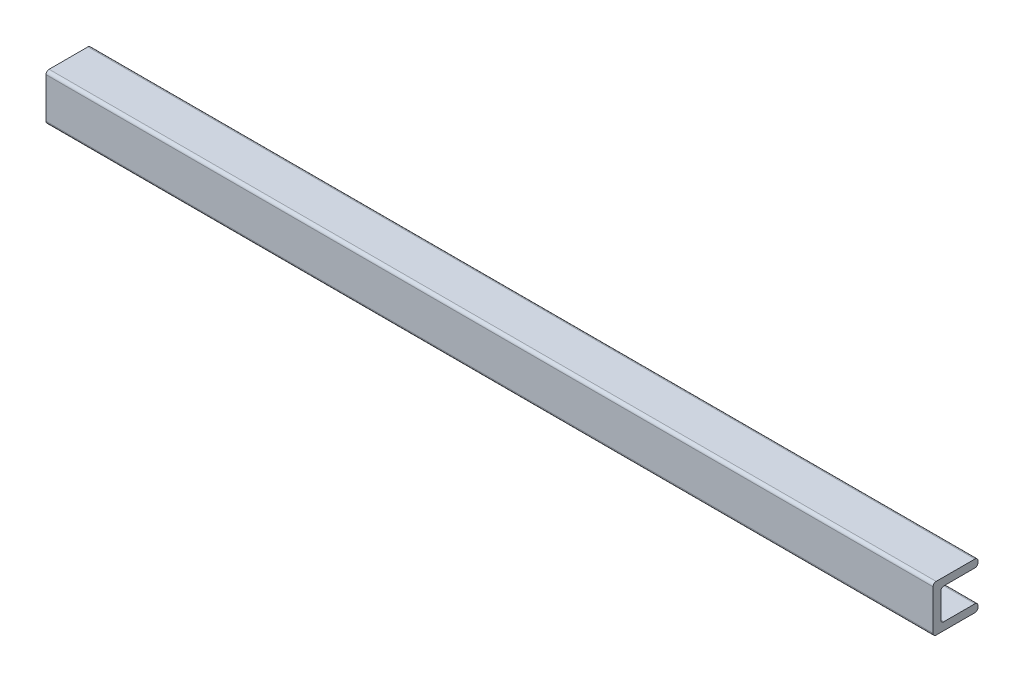
ISO-10303-21;
HEADER;
FILE_DESCRIPTION(('STEP AP214'),'2;1');
FILE_NAME('part.step','',(''),(''),'','','');
FILE_SCHEMA(('AUTOMOTIVE_DESIGN { 1 0 10303 214 1 1 1 1 }'));
ENDSEC;
DATA;
#1=APPLICATION_CONTEXT('core data for automotive mechanical design processes');
#2=APPLICATION_PROTOCOL_DEFINITION('international standard','automotive_design',2000,#1);
#3=PRODUCT_CONTEXT('',#1,'mechanical');
#4=PRODUCT('Part','Part','',(#3));
#5=PRODUCT_RELATED_PRODUCT_CATEGORY('part','',(#4));
#6=PRODUCT_DEFINITION_FORMATION('','',#4);
#7=PRODUCT_DEFINITION_CONTEXT('part definition',#1,'design');
#8=PRODUCT_DEFINITION('design','',#6,#7);
#9=PRODUCT_DEFINITION_SHAPE('','',#8);
#10=(LENGTH_UNIT() NAMED_UNIT(*) SI_UNIT(.MILLI.,.METRE.));
#11=(NAMED_UNIT(*) PLANE_ANGLE_UNIT() SI_UNIT($,.RADIAN.));
#12=(NAMED_UNIT(*) SI_UNIT($,.STERADIAN.) SOLID_ANGLE_UNIT());
#13=UNCERTAINTY_MEASURE_WITH_UNIT(LENGTH_MEASURE(1.E-05),#10,'distance_accuracy_value','');
#14=(GEOMETRIC_REPRESENTATION_CONTEXT(3) GLOBAL_UNCERTAINTY_ASSIGNED_CONTEXT((#13)) GLOBAL_UNIT_ASSIGNED_CONTEXT((#10,
#11,#12)) REPRESENTATION_CONTEXT('',''));
#15=CARTESIAN_POINT('',(0.,0.,0.));
#16=DIRECTION('',(0.,0.,1.));
#17=DIRECTION('',(1.,0.,0.));
#18=AXIS2_PLACEMENT_3D('',#15,#16,#17);
#19=CARTESIAN_POINT('',(602.,12.,168.));
#20=DIRECTION('',(-1.,0.,0.));
#21=DIRECTION('',(0.,0.,1.));
#22=AXIS2_PLACEMENT_3D('',#19,#20,#21);
#23=CYLINDRICAL_SURFACE('',#22,2.);
#24=CARTESIAN_POINT('',(30.,12.,168.));
#25=DIRECTION('',(1.,0.,0.));
#26=DIRECTION('',(0.,0.,-1.));
#27=AXIS2_PLACEMENT_3D('',#24,#25,#26);
#28=CIRCLE('',#27,2.);
#29=CARTESIAN_POINT('',(30.,10.,168.));
#30=VERTEX_POINT('',#29);
#31=CARTESIAN_POINT('',(30.,12.,166.));
#32=VERTEX_POINT('',#31);
#33=EDGE_CURVE('E219',#30,#32,#28,.T.);
#34=ORIENTED_EDGE('',*,*,#33,.T.);
#35=DIRECTION('',(-1.,0.,0.));
#36=VECTOR('',#35,1.);
#37=CARTESIAN_POINT('',(602.,12.,166.));
#38=LINE('',#37,#36);
#39=CARTESIAN_POINT('',(602.,12.,166.));
#40=VERTEX_POINT('',#39);
#41=EDGE_CURVE('E13',#40,#32,#38,.T.);
#42=ORIENTED_EDGE('',*,*,#41,.F.);
#43=CARTESIAN_POINT('',(602.,12.,168.));
#44=DIRECTION('',(1.,0.,0.));
#45=DIRECTION('',(0.,0.,-1.));
#46=AXIS2_PLACEMENT_3D('',#43,#44,#45);
#47=CIRCLE('',#46,2.);
#48=CARTESIAN_POINT('',(602.,10.,168.));
#49=VERTEX_POINT('',#48);
#50=EDGE_CURVE('E267',#49,#40,#47,.T.);
#51=ORIENTED_EDGE('',*,*,#50,.F.);
#52=DIRECTION('',(-1.,0.,0.));
#53=VECTOR('',#52,1.);
#54=CARTESIAN_POINT('',(602.,10.,168.));
#55=LINE('',#54,#53);
#56=EDGE_CURVE('E215',#49,#30,#55,.T.);
#57=ORIENTED_EDGE('',*,*,#56,.T.);
#58=EDGE_LOOP('',(#34,#42,#51,#57));
#59=FACE_BOUND('',#58,.T.);
#60=ADVANCED_FACE('F57',(#59),#23,.T.);
#61=CARTESIAN_POINT('',(602.,13.,166.));
#62=DIRECTION('',(0.,0.,1.));
#63=DIRECTION('',(0.,-1.,0.));
#64=AXIS2_PLACEMENT_3D('',#61,#62,#63);
#65=PLANE('',#64);
#66=DIRECTION('',(0.,1.,0.));
#67=VECTOR('',#66,1.);
#68=CARTESIAN_POINT('',(30.,13.,166.));
#69=LINE('',#68,#67);
#70=CARTESIAN_POINT('',(30.,13.,166.));
#71=VERTEX_POINT('',#70);
#72=EDGE_CURVE('E223',#32,#71,#69,.T.);
#73=ORIENTED_EDGE('',*,*,#72,.T.);
#74=DIRECTION('',(-1.,0.,0.));
#75=VECTOR('',#74,1.);
#76=CARTESIAN_POINT('',(602.,13.,166.));
#77=LINE('',#76,#75);
#78=CARTESIAN_POINT('',(602.,13.,166.));
#79=VERTEX_POINT('',#78);
#80=EDGE_CURVE('E65',#79,#71,#77,.T.);
#81=ORIENTED_EDGE('',*,*,#80,.F.);
#82=DIRECTION('',(0.,1.,0.));
#83=VECTOR('',#82,1.);
#84=CARTESIAN_POINT('',(602.,13.,166.));
#85=LINE('',#84,#83);
#86=EDGE_CURVE('E146',#40,#79,#85,.T.);
#87=ORIENTED_EDGE('',*,*,#86,.F.);
#88=ORIENTED_EDGE('',*,*,#41,.T.);
#89=EDGE_LOOP('',(#73,#81,#87,#88));
#90=FACE_BOUND('',#89,.T.);
#91=ADVANCED_FACE('F483',(#90),#65,.F.);
#92=CARTESIAN_POINT('',(602.,13.,168.));
#93=DIRECTION('',(-1.,0.,0.));
#94=DIRECTION('',(0.,0.,1.));
#95=AXIS2_PLACEMENT_3D('',#92,#93,#94);
#96=CYLINDRICAL_SURFACE('',#95,2.00000000000001);
#97=CARTESIAN_POINT('',(30.,13.,168.));
#98=DIRECTION('',(1.,0.,0.));
#99=DIRECTION('',(0.,0.,1.));
#100=AXIS2_PLACEMENT_3D('',#97,#98,#99);
#101=CIRCLE('',#100,2.00000000000001);
#102=CARTESIAN_POINT('',(30.,15.,168.));
#103=VERTEX_POINT('',#102);
#104=EDGE_CURVE('E227',#71,#103,#101,.T.);
#105=ORIENTED_EDGE('',*,*,#104,.T.);
#106=DIRECTION('',(-1.,0.,0.));
#107=VECTOR('',#106,1.);
#108=CARTESIAN_POINT('',(602.,15.,168.));
#109=LINE('',#108,#107);
#110=CARTESIAN_POINT('',(602.,15.,168.));
#111=VERTEX_POINT('',#110);
#112=EDGE_CURVE('E310',#111,#103,#109,.T.);
#113=ORIENTED_EDGE('',*,*,#112,.F.);
#114=CARTESIAN_POINT('',(602.,13.,168.));
#115=DIRECTION('',(1.,0.,0.));
#116=DIRECTION('',(0.,0.,1.));
#117=AXIS2_PLACEMENT_3D('',#114,#115,#116);
#118=CIRCLE('',#117,2.00000000000001);
#119=EDGE_CURVE('E321',#79,#111,#118,.T.);
#120=ORIENTED_EDGE('',*,*,#119,.F.);
#121=ORIENTED_EDGE('',*,*,#80,.T.);
#122=EDGE_LOOP('',(#105,#113,#120,#121));
#123=FACE_BOUND('',#122,.T.);
#124=ADVANCED_FACE('F319',(#123),#96,.T.);
#125=CARTESIAN_POINT('',(602.,15.,168.));
#126=DIRECTION('',(0.,-1.,0.));
#127=DIRECTION('',(0.,0.,-1.));
#128=AXIS2_PLACEMENT_3D('',#125,#126,#127);
#129=PLANE('',#128);
#130=DIRECTION('',(0.,0.,1.));
#131=VECTOR('',#130,1.);
#132=CARTESIAN_POINT('',(30.,15.,168.));
#133=LINE('',#132,#131);
#134=CARTESIAN_POINT('',(30.,15.,193.));
#135=VERTEX_POINT('',#134);
#136=EDGE_CURVE('E230',#103,#135,#133,.T.);
#137=ORIENTED_EDGE('',*,*,#136,.T.);
#138=DIRECTION('',(-1.,0.,0.));
#139=VECTOR('',#138,1.);
#140=CARTESIAN_POINT('',(602.,15.,193.));
#141=LINE('',#140,#139);
#142=CARTESIAN_POINT('',(602.,15.,193.));
#143=VERTEX_POINT('',#142);
#144=EDGE_CURVE('E306',#143,#135,#141,.T.);
#145=ORIENTED_EDGE('',*,*,#144,.F.);
#146=DIRECTION('',(0.,0.,1.));
#147=VECTOR('',#146,1.);
#148=CARTESIAN_POINT('',(602.,15.,168.));
#149=LINE('',#148,#147);
#150=EDGE_CURVE('E340',#111,#143,#149,.T.);
#151=ORIENTED_EDGE('',*,*,#150,.F.);
#152=ORIENTED_EDGE('',*,*,#112,.T.);
#153=EDGE_LOOP('',(#137,#145,#151,#152));
#154=FACE_BOUND('',#153,.T.);
#155=ADVANCED_FACE('F330',(#154),#129,.F.);
#156=CARTESIAN_POINT('',(602.,13.,193.));
#157=DIRECTION('',(-1.,0.,0.));
#158=DIRECTION('',(0.,0.,1.));
#159=AXIS2_PLACEMENT_3D('',#156,#157,#158);
#160=CYLINDRICAL_SURFACE('',#159,2.);
#161=CARTESIAN_POINT('',(30.,13.,193.));
#162=DIRECTION('',(1.,0.,0.));
#163=DIRECTION('',(0.,0.,-1.));
#164=AXIS2_PLACEMENT_3D('',#161,#162,#163);
#165=CIRCLE('',#164,2.);
#166=CARTESIAN_POINT('',(30.,13.,195.));
#167=VERTEX_POINT('',#166);
#168=EDGE_CURVE('E233',#135,#167,#165,.T.);
#169=ORIENTED_EDGE('',*,*,#168,.T.);
#170=DIRECTION('',(-1.,0.,0.));
#171=VECTOR('',#170,1.);
#172=CARTESIAN_POINT('',(602.,13.,195.));
#173=LINE('',#172,#171);
#174=CARTESIAN_POINT('',(602.,13.,195.));
#175=VERTEX_POINT('',#174);
#176=EDGE_CURVE('E302',#175,#167,#173,.T.);
#177=ORIENTED_EDGE('',*,*,#176,.F.);
#178=CARTESIAN_POINT('',(602.,13.,193.));
#179=DIRECTION('',(1.,0.,0.));
#180=DIRECTION('',(0.,0.,-1.));
#181=AXIS2_PLACEMENT_3D('',#178,#179,#180);
#182=CIRCLE('',#181,2.);
#183=EDGE_CURVE('E336',#143,#175,#182,.T.);
#184=ORIENTED_EDGE('',*,*,#183,.F.);
#185=ORIENTED_EDGE('',*,*,#144,.T.);
#186=EDGE_LOOP('',(#169,#177,#184,#185));
#187=FACE_BOUND('',#186,.T.);
#188=ADVANCED_FACE('F334',(#187),#160,.T.);
#189=CARTESIAN_POINT('',(602.,13.,195.));
#190=DIRECTION('',(0.,0.,-1.));
#191=DIRECTION('',(-1.,0.,0.));
#192=AXIS2_PLACEMENT_3D('',#189,#190,#191);
#193=PLANE('',#192);
#194=DIRECTION('',(0.,-1.,0.));
#195=VECTOR('',#194,1.);
#196=CARTESIAN_POINT('',(30.,13.,195.));
#197=LINE('',#196,#195);
#198=CARTESIAN_POINT('',(30.,-13.,195.));
#199=VERTEX_POINT('',#198);
#200=EDGE_CURVE('E236',#167,#199,#197,.T.);
#201=ORIENTED_EDGE('',*,*,#200,.T.);
#202=DIRECTION('',(-1.,0.,0.));
#203=VECTOR('',#202,1.);
#204=CARTESIAN_POINT('',(602.,-13.,195.));
#205=LINE('',#204,#203);
#206=CARTESIAN_POINT('',(602.,-13.,195.));
#207=VERTEX_POINT('',#206);
#208=EDGE_CURVE('E298',#207,#199,#205,.T.);
#209=ORIENTED_EDGE('',*,*,#208,.F.);
#210=DIRECTION('',(0.,-1.,0.));
#211=VECTOR('',#210,1.);
#212=CARTESIAN_POINT('',(602.,13.,195.));
#213=LINE('',#212,#211);
#214=EDGE_CURVE('E339',#175,#207,#213,.T.);
#215=ORIENTED_EDGE('',*,*,#214,.F.);
#216=ORIENTED_EDGE('',*,*,#176,.T.);
#217=EDGE_LOOP('',(#201,#209,#215,#216));
#218=FACE_BOUND('',#217,.T.);
#219=ADVANCED_FACE('F496',(#218),#193,.F.);
#220=CARTESIAN_POINT('',(602.,-13.,193.));
#221=DIRECTION('',(-1.,0.,0.));
#222=DIRECTION('',(0.,0.,1.));
#223=AXIS2_PLACEMENT_3D('',#220,#221,#222);
#224=CYLINDRICAL_SURFACE('',#223,2.);
#225=CARTESIAN_POINT('',(30.,-13.,193.));
#226=DIRECTION('',(1.,0.,0.));
#227=DIRECTION('',(0.,0.,-1.));
#228=AXIS2_PLACEMENT_3D('',#225,#226,#227);
#229=CIRCLE('',#228,2.);
#230=CARTESIAN_POINT('',(30.,-15.,193.));
#231=VERTEX_POINT('',#230);
#232=EDGE_CURVE('E239',#199,#231,#229,.T.);
#233=ORIENTED_EDGE('',*,*,#232,.T.);
#234=DIRECTION('',(-1.,0.,0.));
#235=VECTOR('',#234,1.);
#236=CARTESIAN_POINT('',(602.,-15.,193.));
#237=LINE('',#236,#235);
#238=CARTESIAN_POINT('',(602.,-15.,193.));
#239=VERTEX_POINT('',#238);
#240=EDGE_CURVE('E294',#239,#231,#237,.T.);
#241=ORIENTED_EDGE('',*,*,#240,.F.);
#242=CARTESIAN_POINT('',(602.,-13.,193.));
#243=DIRECTION('',(1.,0.,0.));
#244=DIRECTION('',(0.,0.,-1.));
#245=AXIS2_PLACEMENT_3D('',#242,#243,#244);
#246=CIRCLE('',#245,2.);
#247=EDGE_CURVE('E345',#207,#239,#246,.T.);
#248=ORIENTED_EDGE('',*,*,#247,.F.);
#249=ORIENTED_EDGE('',*,*,#208,.T.);
#250=EDGE_LOOP('',(#233,#241,#248,#249));
#251=FACE_BOUND('',#250,.T.);
#252=ADVANCED_FACE('F499',(#251),#224,.T.);
#253=CARTESIAN_POINT('',(602.,-15.,193.));
#254=DIRECTION('',(0.,1.,0.));
#255=DIRECTION('',(0.,0.,1.));
#256=AXIS2_PLACEMENT_3D('',#253,#254,#255);
#257=PLANE('',#256);
#258=DIRECTION('',(0.,0.,-1.));
#259=VECTOR('',#258,1.);
#260=CARTESIAN_POINT('',(30.,-15.,193.));
#261=LINE('',#260,#259);
#262=CARTESIAN_POINT('',(30.,-15.,168.));
#263=VERTEX_POINT('',#262);
#264=EDGE_CURVE('E242',#231,#263,#261,.T.);
#265=ORIENTED_EDGE('',*,*,#264,.T.);
#266=DIRECTION('',(-1.,0.,0.));
#267=VECTOR('',#266,1.);
#268=CARTESIAN_POINT('',(602.,-15.,168.));
#269=LINE('',#268,#267);
#270=CARTESIAN_POINT('',(602.,-15.,168.));
#271=VERTEX_POINT('',#270);
#272=EDGE_CURVE('E290',#271,#263,#269,.T.);
#273=ORIENTED_EDGE('',*,*,#272,.F.);
#274=DIRECTION('',(0.,0.,-1.));
#275=VECTOR('',#274,1.);
#276=CARTESIAN_POINT('',(602.,-15.,193.));
#277=LINE('',#276,#275);
#278=EDGE_CURVE('E352',#239,#271,#277,.T.);
#279=ORIENTED_EDGE('',*,*,#278,.F.);
#280=ORIENTED_EDGE('',*,*,#240,.T.);
#281=EDGE_LOOP('',(#265,#273,#279,#280));
#282=FACE_BOUND('',#281,.T.);
#283=ADVANCED_FACE('F503',(#282),#257,.F.);
#284=CARTESIAN_POINT('',(602.,-13.,168.));
#285=DIRECTION('',(-1.,0.,0.));
#286=DIRECTION('',(0.,0.,1.));
#287=AXIS2_PLACEMENT_3D('',#284,#285,#286);
#288=CYLINDRICAL_SURFACE('',#287,2.00000000000001);
#289=CARTESIAN_POINT('',(30.,-13.,168.));
#290=DIRECTION('',(1.,0.,0.));
#291=DIRECTION('',(0.,0.,-1.));
#292=AXIS2_PLACEMENT_3D('',#289,#290,#291);
#293=CIRCLE('',#292,2.00000000000001);
#294=CARTESIAN_POINT('',(30.,-13.,166.));
#295=VERTEX_POINT('',#294);
#296=EDGE_CURVE('E245',#263,#295,#293,.T.);
#297=ORIENTED_EDGE('',*,*,#296,.T.);
#298=DIRECTION('',(-1.,0.,0.));
#299=VECTOR('',#298,1.);
#300=CARTESIAN_POINT('',(602.,-13.,166.));
#301=LINE('',#300,#299);
#302=CARTESIAN_POINT('',(602.,-13.,166.));
#303=VERTEX_POINT('',#302);
#304=EDGE_CURVE('E286',#303,#295,#301,.T.);
#305=ORIENTED_EDGE('',*,*,#304,.F.);
#306=CARTESIAN_POINT('',(602.,-13.,168.));
#307=DIRECTION('',(1.,0.,0.));
#308=DIRECTION('',(0.,0.,-1.));
#309=AXIS2_PLACEMENT_3D('',#306,#307,#308);
#310=CIRCLE('',#309,2.00000000000001);
#311=EDGE_CURVE('E355',#271,#303,#310,.T.);
#312=ORIENTED_EDGE('',*,*,#311,.F.);
#313=ORIENTED_EDGE('',*,*,#272,.T.);
#314=EDGE_LOOP('',(#297,#305,#312,#313));
#315=FACE_BOUND('',#314,.T.);
#316=ADVANCED_FACE('F507',(#315),#288,.T.);
#317=CARTESIAN_POINT('',(602.,-12.,166.));
#318=DIRECTION('',(0.,0.,1.));
#319=DIRECTION('',(0.,-1.,0.));
#320=AXIS2_PLACEMENT_3D('',#317,#318,#319);
#321=PLANE('',#320);
#322=DIRECTION('',(0.,1.,0.));
#323=VECTOR('',#322,1.);
#324=CARTESIAN_POINT('',(30.,-12.,166.));
#325=LINE('',#324,#323);
#326=CARTESIAN_POINT('',(30.,-12.,166.));
#327=VERTEX_POINT('',#326);
#328=EDGE_CURVE('E248',#295,#327,#325,.T.);
#329=ORIENTED_EDGE('',*,*,#328,.T.);
#330=DIRECTION('',(-1.,0.,0.));
#331=VECTOR('',#330,1.);
#332=CARTESIAN_POINT('',(602.,-12.,166.));
#333=LINE('',#332,#331);
#334=CARTESIAN_POINT('',(602.,-12.,166.));
#335=VERTEX_POINT('',#334);
#336=EDGE_CURVE('E282',#335,#327,#333,.T.);
#337=ORIENTED_EDGE('',*,*,#336,.F.);
#338=DIRECTION('',(0.,1.,0.));
#339=VECTOR('',#338,1.);
#340=CARTESIAN_POINT('',(602.,-12.,166.));
#341=LINE('',#340,#339);
#342=EDGE_CURVE('E358',#303,#335,#341,.T.);
#343=ORIENTED_EDGE('',*,*,#342,.F.);
#344=ORIENTED_EDGE('',*,*,#304,.T.);
#345=EDGE_LOOP('',(#329,#337,#343,#344));
#346=FACE_BOUND('',#345,.T.);
#347=ADVANCED_FACE('F511',(#346),#321,.F.);
#348=CARTESIAN_POINT('',(602.,-12.,168.));
#349=DIRECTION('',(-1.,0.,0.));
#350=DIRECTION('',(0.,0.,1.));
#351=AXIS2_PLACEMENT_3D('',#348,#349,#350);
#352=CYLINDRICAL_SURFACE('',#351,2.);
#353=CARTESIAN_POINT('',(30.,-12.,168.));
#354=DIRECTION('',(1.,0.,0.));
#355=DIRECTION('',(0.,0.,1.));
#356=AXIS2_PLACEMENT_3D('',#353,#354,#355);
#357=CIRCLE('',#356,2.);
#358=CARTESIAN_POINT('',(30.,-10.,168.));
#359=VERTEX_POINT('',#358);
#360=EDGE_CURVE('E251',#327,#359,#357,.T.);
#361=ORIENTED_EDGE('',*,*,#360,.T.);
#362=DIRECTION('',(-1.,0.,0.));
#363=VECTOR('',#362,1.);
#364=CARTESIAN_POINT('',(602.,-10.,168.));
#365=LINE('',#364,#363);
#366=CARTESIAN_POINT('',(602.,-10.,168.));
#367=VERTEX_POINT('',#366);
#368=EDGE_CURVE('E278',#367,#359,#365,.T.);
#369=ORIENTED_EDGE('',*,*,#368,.F.);
#370=CARTESIAN_POINT('',(602.,-12.,168.));
#371=DIRECTION('',(1.,0.,0.));
#372=DIRECTION('',(0.,0.,1.));
#373=AXIS2_PLACEMENT_3D('',#370,#371,#372);
#374=CIRCLE('',#373,2.);
#375=EDGE_CURVE('E361',#335,#367,#374,.T.);
#376=ORIENTED_EDGE('',*,*,#375,.F.);
#377=ORIENTED_EDGE('',*,*,#336,.T.);
#378=EDGE_LOOP('',(#361,#369,#376,#377));
#379=FACE_BOUND('',#378,.T.);
#380=ADVANCED_FACE('F515',(#379),#352,.T.);
#381=CARTESIAN_POINT('',(602.,-10.,188.));
#382=DIRECTION('',(0.,-1.,0.));
#383=DIRECTION('',(0.,0.,-1.));
#384=AXIS2_PLACEMENT_3D('',#381,#382,#383);
#385=PLANE('',#384);
#386=DIRECTION('',(0.,0.,1.));
#387=VECTOR('',#386,1.);
#388=CARTESIAN_POINT('',(30.,-10.,188.));
#389=LINE('',#388,#387);
#390=CARTESIAN_POINT('',(30.,-10.,188.));
#391=VERTEX_POINT('',#390);
#392=EDGE_CURVE('E254',#359,#391,#389,.T.);
#393=ORIENTED_EDGE('',*,*,#392,.T.);
#394=DIRECTION('',(-1.,0.,0.));
#395=VECTOR('',#394,1.);
#396=CARTESIAN_POINT('',(602.,-10.,188.));
#397=LINE('',#396,#395);
#398=CARTESIAN_POINT('',(602.,-10.,188.));
#399=VERTEX_POINT('',#398);
#400=EDGE_CURVE('E274',#399,#391,#397,.T.);
#401=ORIENTED_EDGE('',*,*,#400,.F.);
#402=DIRECTION('',(0.,0.,1.));
#403=VECTOR('',#402,1.);
#404=CARTESIAN_POINT('',(602.,-10.,188.));
#405=LINE('',#404,#403);
#406=EDGE_CURVE('E364',#367,#399,#405,.T.);
#407=ORIENTED_EDGE('',*,*,#406,.F.);
#408=ORIENTED_EDGE('',*,*,#368,.T.);
#409=EDGE_LOOP('',(#393,#401,#407,#408));
#410=FACE_BOUND('',#409,.T.);
#411=ADVANCED_FACE('F381',(#410),#385,.F.);
#412=CARTESIAN_POINT('',(602.,-8.,188.));
#413=DIRECTION('',(-1.,0.,0.));
#414=DIRECTION('',(0.,0.,1.));
#415=AXIS2_PLACEMENT_3D('',#412,#413,#414);
#416=CYLINDRICAL_SURFACE('',#415,2.);
#417=CARTESIAN_POINT('',(30.,-8.,188.));
#418=DIRECTION('',(-1.,0.,0.));
#419=DIRECTION('',(0.,0.,-1.));
#420=AXIS2_PLACEMENT_3D('',#417,#418,#419);
#421=CIRCLE('',#420,2.);
#422=CARTESIAN_POINT('',(30.,-8.,190.));
#423=VERTEX_POINT('',#422);
#424=EDGE_CURVE('E257',#391,#423,#421,.T.);
#425=ORIENTED_EDGE('',*,*,#424,.T.);
#426=DIRECTION('',(-1.,0.,0.));
#427=VECTOR('',#426,1.);
#428=CARTESIAN_POINT('',(602.,-8.,190.));
#429=LINE('',#428,#427);
#430=CARTESIAN_POINT('',(602.,-8.,190.));
#431=VERTEX_POINT('',#430);
#432=EDGE_CURVE('E207',#431,#423,#429,.T.);
#433=ORIENTED_EDGE('',*,*,#432,.F.);
#434=CARTESIAN_POINT('',(602.,-8.,188.));
#435=DIRECTION('',(-1.,0.,0.));
#436=DIRECTION('',(0.,0.,-1.));
#437=AXIS2_PLACEMENT_3D('',#434,#435,#436);
#438=CIRCLE('',#437,2.);
#439=EDGE_CURVE('E193',#399,#431,#438,.T.);
#440=ORIENTED_EDGE('',*,*,#439,.F.);
#441=ORIENTED_EDGE('',*,*,#400,.T.);
#442=EDGE_LOOP('',(#425,#433,#440,#441));
#443=FACE_BOUND('',#442,.T.);
#444=ADVANCED_FACE('F385',(#443),#416,.F.);
#445=CARTESIAN_POINT('',(602.,8.,190.));
#446=DIRECTION('',(0.,0.,1.));
#447=DIRECTION('',(1.,0.,0.));
#448=AXIS2_PLACEMENT_3D('',#445,#446,#447);
#449=PLANE('',#448);
#450=DIRECTION('',(1.,0.,0.));
#451=VECTOR('',#450,1.);
#452=CARTESIAN_POINT('',(0.,-2.25,190.));
#453=LINE('',#452,#451);
#454=CARTESIAN_POINT('',(70.,-2.25,190.));
#455=VERTEX_POINT('',#454);
#456=CARTESIAN_POINT('',(560.,-2.25000000000006,190.));
#457=VERTEX_POINT('',#456);
#458=EDGE_CURVE('E423',#455,#457,#453,.T.);
#459=ORIENTED_EDGE('',*,*,#458,.T.);
#460=CARTESIAN_POINT('',(560.,-1.27443532033127E-13,190.));
#461=DIRECTION('',(0.,0.,-1.));
#462=DIRECTION('',(-1.,0.,0.));
#463=AXIS2_PLACEMENT_3D('',#460,#461,#462);
#464=CIRCLE('',#463,2.25000000000006);
#465=CARTESIAN_POINT('',(560.,2.25000000000006,190.));
#466=VERTEX_POINT('',#465);
#467=EDGE_CURVE('E72',#466,#457,#464,.T.);
#468=ORIENTED_EDGE('',*,*,#467,.F.);
#469=DIRECTION('',(1.,0.,0.));
#470=VECTOR('',#469,1.);
#471=CARTESIAN_POINT('',(0.,2.25,190.));
#472=LINE('',#471,#470);
#473=CARTESIAN_POINT('',(70.,2.25,190.));
#474=VERTEX_POINT('',#473);
#475=EDGE_CURVE('E414',#474,#466,#472,.T.);
#476=ORIENTED_EDGE('',*,*,#475,.F.);
#477=CARTESIAN_POINT('',(70.,0.,190.));
#478=DIRECTION('',(0.,0.,-1.));
#479=DIRECTION('',(-1.,0.,0.));
#480=AXIS2_PLACEMENT_3D('',#477,#478,#479);
#481=CIRCLE('',#480,2.25);
#482=EDGE_CURVE('E419',#474,#455,#481,.F.);
#483=ORIENTED_EDGE('',*,*,#482,.T.);
#484=EDGE_LOOP('',(#459,#468,#476,#483));
#485=FACE_BOUND('',#484,.T.);
#486=DIRECTION('',(0.,1.,0.));
#487=VECTOR('',#486,1.);
#488=CARTESIAN_POINT('',(30.,8.,190.));
#489=LINE('',#488,#487);
#490=CARTESIAN_POINT('',(30.,8.,190.));
#491=VERTEX_POINT('',#490);
#492=EDGE_CURVE('E203',#423,#491,#489,.T.);
#493=ORIENTED_EDGE('',*,*,#492,.T.);
#494=DIRECTION('',(-1.,0.,0.));
#495=VECTOR('',#494,1.);
#496=CARTESIAN_POINT('',(602.,8.,190.));
#497=LINE('',#496,#495);
#498=CARTESIAN_POINT('',(602.,8.,190.));
#499=VERTEX_POINT('',#498);
#500=EDGE_CURVE('E200',#499,#491,#497,.T.);
#501=ORIENTED_EDGE('',*,*,#500,.F.);
#502=DIRECTION('',(0.,1.,0.));
#503=VECTOR('',#502,1.);
#504=CARTESIAN_POINT('',(602.,8.,190.));
#505=LINE('',#504,#503);
#506=EDGE_CURVE('E186',#431,#499,#505,.T.);
#507=ORIENTED_EDGE('',*,*,#506,.F.);
#508=ORIENTED_EDGE('',*,*,#432,.T.);
#509=EDGE_LOOP('',(#493,#501,#507,#508));
#510=FACE_BOUND('',#509,.T.);
#511=ADVANCED_FACE('F201',(#485,#510),#449,.F.);
#512=CARTESIAN_POINT('',(602.,8.,188.));
#513=DIRECTION('',(-1.,0.,0.));
#514=DIRECTION('',(0.,0.,1.));
#515=AXIS2_PLACEMENT_3D('',#512,#513,#514);
#516=CYLINDRICAL_SURFACE('',#515,2.);
#517=CARTESIAN_POINT('',(30.,8.,188.));
#518=DIRECTION('',(-1.,0.,0.));
#519=DIRECTION('',(0.,0.,-1.));
#520=AXIS2_PLACEMENT_3D('',#517,#518,#519);
#521=CIRCLE('',#520,2.);
#522=CARTESIAN_POINT('',(30.,10.,188.));
#523=VERTEX_POINT('',#522);
#524=EDGE_CURVE('E262',#491,#523,#521,.T.);
#525=ORIENTED_EDGE('',*,*,#524,.T.);
#526=DIRECTION('',(-1.,0.,0.));
#527=VECTOR('',#526,1.);
#528=CARTESIAN_POINT('',(602.,10.,188.));
#529=LINE('',#528,#527);
#530=CARTESIAN_POINT('',(602.,10.,188.));
#531=VERTEX_POINT('',#530);
#532=EDGE_CURVE('E208',#531,#523,#529,.T.);
#533=ORIENTED_EDGE('',*,*,#532,.F.);
#534=CARTESIAN_POINT('',(602.,8.,188.));
#535=DIRECTION('',(-1.,0.,0.));
#536=DIRECTION('',(0.,0.,-1.));
#537=AXIS2_PLACEMENT_3D('',#534,#535,#536);
#538=CIRCLE('',#537,2.);
#539=EDGE_CURVE('E190',#499,#531,#538,.T.);
#540=ORIENTED_EDGE('',*,*,#539,.F.);
#541=ORIENTED_EDGE('',*,*,#500,.T.);
#542=EDGE_LOOP('',(#525,#533,#540,#541));
#543=FACE_BOUND('',#542,.T.);
#544=ADVANCED_FACE('F210',(#543),#516,.F.);
#545=CARTESIAN_POINT('',(602.,10.,168.));
#546=DIRECTION('',(0.,1.,0.));
#547=DIRECTION('',(0.,0.,1.));
#548=AXIS2_PLACEMENT_3D('',#545,#546,#547);
#549=PLANE('',#548);
#550=DIRECTION('',(0.,0.,-1.));
#551=VECTOR('',#550,1.);
#552=CARTESIAN_POINT('',(30.,10.,168.));
#553=LINE('',#552,#551);
#554=EDGE_CURVE('E138',#523,#30,#553,.T.);
#555=ORIENTED_EDGE('',*,*,#554,.T.);
#556=ORIENTED_EDGE('',*,*,#56,.F.);
#557=DIRECTION('',(0.,0.,-1.));
#558=VECTOR('',#557,1.);
#559=CARTESIAN_POINT('',(602.,10.,168.));
#560=LINE('',#559,#558);
#561=EDGE_CURVE('E81',#531,#49,#560,.T.);
#562=ORIENTED_EDGE('',*,*,#561,.F.);
#563=ORIENTED_EDGE('',*,*,#532,.T.);
#564=EDGE_LOOP('',(#555,#556,#562,#563));
#565=FACE_BOUND('',#564,.T.);
#566=ADVANCED_FACE('F386',(#565),#549,.F.);
#567=CARTESIAN_POINT('',(602.,12.,168.));
#568=DIRECTION('',(1.,0.,0.));
#569=DIRECTION('',(0.,0.,-1.));
#570=AXIS2_PLACEMENT_3D('',#567,#568,#569);
#571=PLANE('',#570);
#572=ORIENTED_EDGE('',*,*,#50,.T.);
#573=ORIENTED_EDGE('',*,*,#86,.T.);
#574=ORIENTED_EDGE('',*,*,#119,.T.);
#575=ORIENTED_EDGE('',*,*,#150,.T.);
#576=ORIENTED_EDGE('',*,*,#183,.T.);
#577=ORIENTED_EDGE('',*,*,#214,.T.);
#578=ORIENTED_EDGE('',*,*,#247,.T.);
#579=ORIENTED_EDGE('',*,*,#278,.T.);
#580=ORIENTED_EDGE('',*,*,#311,.T.);
#581=ORIENTED_EDGE('',*,*,#342,.T.);
#582=ORIENTED_EDGE('',*,*,#375,.T.);
#583=ORIENTED_EDGE('',*,*,#406,.T.);
#584=ORIENTED_EDGE('',*,*,#439,.T.);
#585=ORIENTED_EDGE('',*,*,#506,.T.);
#586=ORIENTED_EDGE('',*,*,#539,.T.);
#587=ORIENTED_EDGE('',*,*,#561,.T.);
#588=EDGE_LOOP('',(#572,#573,#574,#575,#576,#577,#578,#579,#580,#581,#582,#583,#584,#585,#586,#587));
#589=FACE_BOUND('',#588,.T.);
#590=ADVANCED_FACE('F188',(#589),#571,.T.);
#591=CARTESIAN_POINT('',(30.,12.,168.));
#592=DIRECTION('',(1.,0.,0.));
#593=DIRECTION('',(0.,0.,-1.));
#594=AXIS2_PLACEMENT_3D('',#591,#592,#593);
#595=PLANE('',#594);
#596=ORIENTED_EDGE('',*,*,#33,.F.);
#597=ORIENTED_EDGE('',*,*,#554,.F.);
#598=ORIENTED_EDGE('',*,*,#524,.F.);
#599=ORIENTED_EDGE('',*,*,#492,.F.);
#600=ORIENTED_EDGE('',*,*,#424,.F.);
#601=ORIENTED_EDGE('',*,*,#392,.F.);
#602=ORIENTED_EDGE('',*,*,#360,.F.);
#603=ORIENTED_EDGE('',*,*,#328,.F.);
#604=ORIENTED_EDGE('',*,*,#296,.F.);
#605=ORIENTED_EDGE('',*,*,#264,.F.);
#606=ORIENTED_EDGE('',*,*,#232,.F.);
#607=ORIENTED_EDGE('',*,*,#200,.F.);
#608=ORIENTED_EDGE('',*,*,#168,.F.);
#609=ORIENTED_EDGE('',*,*,#136,.F.);
#610=ORIENTED_EDGE('',*,*,#104,.F.);
#611=ORIENTED_EDGE('',*,*,#72,.F.);
#612=EDGE_LOOP('',(#596,#597,#598,#599,#600,#601,#602,#603,#604,#605,#606,#607,#608,#609,#610,#611));
#613=FACE_BOUND('',#612,.T.);
#614=ADVANCED_FACE('F325',(#613),#595,.F.);
#615=CARTESIAN_POINT('',(560.,-1.27443532033127E-13,194.5));
#616=DIRECTION('',(0.,0.,-1.));
#617=DIRECTION('',(-1.,0.,0.));
#618=AXIS2_PLACEMENT_3D('',#615,#616,#617);
#619=CYLINDRICAL_SURFACE('',#618,2.25000000000006);
#620=ORIENTED_EDGE('',*,*,#467,.T.);
#621=DIRECTION('',(0.,0.,-1.));
#622=VECTOR('',#621,1.);
#623=CARTESIAN_POINT('',(560.,-2.25000000000006,194.5));
#624=LINE('',#623,#622);
#625=CARTESIAN_POINT('',(560.,-2.25000000000006,194.5));
#626=VERTEX_POINT('',#625);
#627=EDGE_CURVE('E396',#626,#457,#624,.T.);
#628=ORIENTED_EDGE('',*,*,#627,.F.);
#629=CARTESIAN_POINT('',(560.,-1.27443532033127E-13,194.5));
#630=DIRECTION('',(0.,0.,-1.));
#631=DIRECTION('',(-1.,0.,0.));
#632=AXIS2_PLACEMENT_3D('',#629,#630,#631);
#633=CIRCLE('',#632,2.25000000000006);
#634=CARTESIAN_POINT('',(560.,2.25000000000006,194.5));
#635=VERTEX_POINT('',#634);
#636=EDGE_CURVE('E418',#635,#626,#633,.T.);
#637=ORIENTED_EDGE('',*,*,#636,.F.);
#638=DIRECTION('',(0.,0.,-1.));
#639=VECTOR('',#638,1.);
#640=CARTESIAN_POINT('',(560.,2.25000000000006,194.5));
#641=LINE('',#640,#639);
#642=EDGE_CURVE('E224',#635,#466,#641,.T.);
#643=ORIENTED_EDGE('',*,*,#642,.T.);
#644=EDGE_LOOP('',(#620,#628,#637,#643));
#645=FACE_BOUND('',#644,.T.);
#646=ADVANCED_FACE('F452',(#645),#619,.F.);
#647=CARTESIAN_POINT('',(0.,2.25,194.5));
#648=DIRECTION('',(0.,1.,0.));
#649=DIRECTION('',(-1.,0.,0.));
#650=AXIS2_PLACEMENT_3D('',#647,#648,#649);
#651=PLANE('',#650);
#652=ORIENTED_EDGE('',*,*,#475,.T.);
#653=ORIENTED_EDGE('',*,*,#642,.F.);
#654=DIRECTION('',(1.,0.,0.));
#655=VECTOR('',#654,1.);
#656=CARTESIAN_POINT('',(0.,2.25,194.5));
#657=LINE('',#656,#655);
#658=CARTESIAN_POINT('',(70.,2.25,194.5));
#659=VERTEX_POINT('',#658);
#660=EDGE_CURVE('E404',#659,#635,#657,.T.);
#661=ORIENTED_EDGE('',*,*,#660,.F.);
#662=DIRECTION('',(0.,0.,-1.));
#663=VECTOR('',#662,1.);
#664=CARTESIAN_POINT('',(70.,2.25,194.5));
#665=LINE('',#664,#663);
#666=EDGE_CURVE('E408',#659,#474,#665,.T.);
#667=ORIENTED_EDGE('',*,*,#666,.T.);
#668=EDGE_LOOP('',(#652,#653,#661,#667));
#669=FACE_BOUND('',#668,.T.);
#670=ADVANCED_FACE('F464',(#669),#651,.F.);
#671=CARTESIAN_POINT('',(70.,0.,194.5));
#672=DIRECTION('',(0.,0.,-1.));
#673=DIRECTION('',(-1.,0.,0.));
#674=AXIS2_PLACEMENT_3D('',#671,#672,#673);
#675=CYLINDRICAL_SURFACE('',#674,2.25);
#676=ORIENTED_EDGE('',*,*,#482,.F.);
#677=ORIENTED_EDGE('',*,*,#666,.F.);
#678=CARTESIAN_POINT('',(70.,0.,194.5));
#679=DIRECTION('',(0.,0.,-1.));
#680=DIRECTION('',(-1.,0.,0.));
#681=AXIS2_PLACEMENT_3D('',#678,#679,#680);
#682=CIRCLE('',#681,2.25);
#683=CARTESIAN_POINT('',(70.,-2.25,194.5));
#684=VERTEX_POINT('',#683);
#685=EDGE_CURVE('E432',#659,#684,#682,.F.);
#686=ORIENTED_EDGE('',*,*,#685,.T.);
#687=DIRECTION('',(0.,0.,-1.));
#688=VECTOR('',#687,1.);
#689=CARTESIAN_POINT('',(70.,-2.25,194.5));
#690=LINE('',#689,#688);
#691=EDGE_CURVE('E403',#684,#455,#690,.T.);
#692=ORIENTED_EDGE('',*,*,#691,.T.);
#693=EDGE_LOOP('',(#676,#677,#686,#692));
#694=FACE_BOUND('',#693,.T.);
#695=ADVANCED_FACE('F467',(#694),#675,.F.);
#696=CARTESIAN_POINT('',(0.,-2.25,194.5));
#697=DIRECTION('',(0.,1.,0.));
#698=DIRECTION('',(-1.,0.,0.));
#699=AXIS2_PLACEMENT_3D('',#696,#697,#698);
#700=PLANE('',#699);
#701=ORIENTED_EDGE('',*,*,#458,.F.);
#702=ORIENTED_EDGE('',*,*,#691,.F.);
#703=DIRECTION('',(1.,0.,0.));
#704=VECTOR('',#703,1.);
#705=CARTESIAN_POINT('',(0.,-2.25,194.5));
#706=LINE('',#705,#704);
#707=EDGE_CURVE('E436',#684,#626,#706,.T.);
#708=ORIENTED_EDGE('',*,*,#707,.T.);
#709=ORIENTED_EDGE('',*,*,#627,.T.);
#710=EDGE_LOOP('',(#701,#702,#708,#709));
#711=FACE_BOUND('',#710,.T.);
#712=ADVANCED_FACE('F472',(#711),#700,.T.);
#713=CARTESIAN_POINT('',(0.,0.,194.5));
#714=DIRECTION('',(0.,0.,-1.));
#715=DIRECTION('',(-1.,0.,0.));
#716=AXIS2_PLACEMENT_3D('',#713,#714,#715);
#717=PLANE('',#716);
#718=ORIENTED_EDGE('',*,*,#636,.T.);
#719=ORIENTED_EDGE('',*,*,#707,.F.);
#720=ORIENTED_EDGE('',*,*,#685,.F.);
#721=ORIENTED_EDGE('',*,*,#660,.T.);
#722=EDGE_LOOP('',(#718,#719,#720,#721));
#723=FACE_BOUND('',#722,.T.);
#724=ADVANCED_FACE('F447',(#723),#717,.T.);
#725=CLOSED_SHELL('',(#60,#91,#124,#155,#188,#219,#252,#283,#316,#347,#380,#411,#444,#511,#544,
#566,#590,#614,#646,#670,#695,#712,#724));
#726=MANIFOLD_SOLID_BREP('B2',#725);
#727=ADVANCED_BREP_SHAPE_REPRESENTATION('',(#18,#726),#14);
#728=SHAPE_DEFINITION_REPRESENTATION(#9,#727);
ENDSEC;
END-ISO-10303-21;
